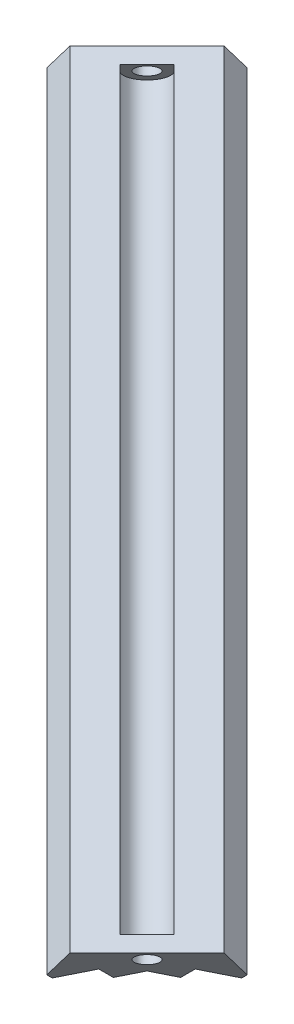
ISO-10303-21;
HEADER;
FILE_DESCRIPTION(('STEP AP214'),'2;1');
FILE_NAME('part.step','',(''),(''),'','','');
FILE_SCHEMA(('AUTOMOTIVE_DESIGN { 1 0 10303 214 1 1 1 1 }'));
ENDSEC;
DATA;
#1=APPLICATION_CONTEXT('core data for automotive mechanical design processes');
#2=APPLICATION_PROTOCOL_DEFINITION('international standard','automotive_design',2000,#1);
#3=PRODUCT_CONTEXT('',#1,'mechanical');
#4=PRODUCT('Part','Part','',(#3));
#5=PRODUCT_RELATED_PRODUCT_CATEGORY('part','',(#4));
#6=PRODUCT_DEFINITION_FORMATION('','',#4);
#7=PRODUCT_DEFINITION_CONTEXT('part definition',#1,'design');
#8=PRODUCT_DEFINITION('design','',#6,#7);
#9=PRODUCT_DEFINITION_SHAPE('','',#8);
#10=(LENGTH_UNIT() NAMED_UNIT(*) SI_UNIT(.MILLI.,.METRE.));
#11=(NAMED_UNIT(*) PLANE_ANGLE_UNIT() SI_UNIT($,.RADIAN.));
#12=(NAMED_UNIT(*) SI_UNIT($,.STERADIAN.) SOLID_ANGLE_UNIT());
#13=UNCERTAINTY_MEASURE_WITH_UNIT(LENGTH_MEASURE(1.E-05),#10,'distance_accuracy_value','');
#14=(GEOMETRIC_REPRESENTATION_CONTEXT(3) GLOBAL_UNCERTAINTY_ASSIGNED_CONTEXT((#13)) GLOBAL_UNIT_ASSIGNED_CONTEXT((#10,
#11,#12)) REPRESENTATION_CONTEXT('',''));
#15=CARTESIAN_POINT('',(0.,0.,0.));
#16=DIRECTION('',(0.,0.,1.));
#17=DIRECTION('',(1.,0.,0.));
#18=AXIS2_PLACEMENT_3D('',#15,#16,#17);
#19=CARTESIAN_POINT('',(-75.8047394497521,-82.0349992201413,-75.8047394497521));
#20=DIRECTION('',(0.577350269189628,-0.577350269189621,0.577350269189628));
#21=DIRECTION('',(0.707106781186547,0.,-0.707106781186548));
#22=AXIS2_PLACEMENT_3D('',#19,#20,#21);
#23=CYLINDRICAL_SURFACE('',#22,1.55000000000003);
#24=CARTESIAN_POINT('',(-69.1083679242941,-88.7313707455993,-69.1083679242941));
#25=DIRECTION('',(0.577350269189626,-0.577350269189626,0.577350269189626));
#26=DIRECTION('',(0.,-0.707106781186548,-0.707106781186548));
#27=AXIS2_PLACEMENT_3D('',#24,#25,#26);
#28=CIRCLE('',#27,1.55000000000003);
#29=CARTESIAN_POINT('',(-69.1083679242941,-89.8273862564385,-70.2043834351332));
#30=VERTEX_POINT('',#29);
#31=EDGE_CURVE('E50',#30,#30,#28,.T.);
#32=ORIENTED_EDGE('',*,*,#31,.F.);
#33=EDGE_LOOP('',(#32));
#34=FACE_BOUND('',#33,.T.);
#35=CARTESIAN_POINT('',(-67.9536673859148,-89.8860712839786,-67.9536673859148));
#36=DIRECTION('',(0.577350269189626,-0.577350269189626,0.577350269189626));
#37=DIRECTION('',(0.,-0.707106781186548,-0.707106781186548));
#38=AXIS2_PLACEMENT_3D('',#35,#36,#37);
#39=CIRCLE('',#38,1.55000000000003);
#40=CARTESIAN_POINT('',(-67.9536673859148,-90.9820867948177,-69.049682896754));
#41=VERTEX_POINT('',#40);
#42=EDGE_CURVE('E193',#41,#41,#39,.F.);
#43=ORIENTED_EDGE('',*,*,#42,.F.);
#44=EDGE_LOOP('',(#43));
#45=FACE_BOUND('',#44,.T.);
#46=ADVANCED_FACE('F46',(#34,#45),#23,.F.);
#47=CARTESIAN_POINT('',(40.6703768682109,-40.6703768682104,40.670376868211));
#48=DIRECTION('',(-0.577350269189628,0.577350269189621,-0.577350269189628));
#49=DIRECTION('',(-0.707106781186548,0.,0.707106781186548));
#50=AXIS2_PLACEMENT_3D('',#47,#48,#49);
#51=PLANE('',#50);
#52=CARTESIAN_POINT('',(-11.9428693550863,-145.896869314806,-11.9428693550863));
#53=DIRECTION('',(-0.577350269189628,0.577350269189621,-0.577350269189628));
#54=DIRECTION('',(-0.707106781186548,0.,0.707106781186548));
#55=AXIS2_PLACEMENT_3D('',#52,#53,#54);
#56=CIRCLE('',#55,1.55000000000003);
#57=CARTESIAN_POINT('',(-13.0388848659255,-145.896869314806,-10.8468538442471));
#58=VERTEX_POINT('',#57);
#59=EDGE_CURVE('E192',#58,#58,#56,.T.);
#60=ORIENTED_EDGE('',*,*,#59,.T.);
#61=EDGE_LOOP('',(#60));
#62=FACE_BOUND('',#61,.T.);
#63=DIRECTION('',(0.816496580927724,0.408248290463864,-0.408248290463865));
#64=VECTOR('',#63,1.);
#65=CARTESIAN_POINT('',(40.6703768682112,-119.614703398697,-38.2739496622747));
#66=LINE('',#65,#64);
#67=CARTESIAN_POINT('',(-21.1505176478224,-150.525150656714,-7.36350240425769));
#68=VERTEX_POINT('',#67);
#69=CARTESIAN_POINT('',(-16.6393740381967,-148.269578851901,-9.61907420907049));
#70=VERTEX_POINT('',#69);
#71=EDGE_CURVE('E246',#68,#70,#66,.T.);
#72=ORIENTED_EDGE('',*,*,#71,.T.);
#73=DIRECTION('',(0.,0.707106781186551,0.707106781186544));
#74=VECTOR('',#73,1.);
#75=CARTESIAN_POINT('',(-16.6393740381967,-148.269578851901,-9.6190742090701));
#76=LINE('',#75,#74);
#77=CARTESIAN_POINT('',(-16.6393740381967,-150.390899195461,-11.7403945526302));
#78=VERTEX_POINT('',#77);
#79=EDGE_CURVE('E233',#78,#70,#76,.T.);
#80=ORIENTED_EDGE('',*,*,#79,.F.);
#81=DIRECTION('',(0.816496580927724,0.408248290463865,-0.408248290463865));
#82=VECTOR('',#81,1.);
#83=CARTESIAN_POINT('',(94.7141414509076,-94.714141450908,-67.4171522971827));
#84=LINE('',#83,#82);
#85=CARTESIAN_POINT('',(-13.3733877144857,-148.757906033605,-13.3733877144857));
#86=VERTEX_POINT('',#85);
#87=EDGE_CURVE('E236',#78,#86,#84,.T.);
#88=ORIENTED_EDGE('',*,*,#87,.T.);
#89=DIRECTION('',(0.408248290463865,-0.408248290463865,-0.816496580927724));
#90=VECTOR('',#89,1.);
#91=CARTESIAN_POINT('',(40.6703768682113,-202.801670616302,-121.460916879879));
#92=LINE('',#91,#90);
#93=CARTESIAN_POINT('',(-11.7403945526303,-150.390899195461,-16.6393740381966));
#94=VERTEX_POINT('',#93);
#95=EDGE_CURVE('E250',#86,#94,#92,.T.);
#96=ORIENTED_EDGE('',*,*,#95,.T.);
#97=DIRECTION('',(0.707106781186544,0.707106781186551,0.));
#98=VECTOR('',#97,1.);
#99=CARTESIAN_POINT('',(-9.61907420907016,-148.269578851901,-16.6393740381966));
#100=LINE('',#99,#98);
#101=CARTESIAN_POINT('',(-9.61907420907059,-148.269578851901,-16.6393740381966));
#102=VERTEX_POINT('',#101);
#103=EDGE_CURVE('E256',#94,#102,#100,.T.);
#104=ORIENTED_EDGE('',*,*,#103,.T.);
#105=DIRECTION('',(0.408248290463865,-0.408248290463865,-0.816496580927724));
#106=VECTOR('',#105,1.);
#107=CARTESIAN_POINT('',(-38.2739496622748,-119.614703398697,40.6703768682113));
#108=LINE('',#107,#106);
#109=CARTESIAN_POINT('',(-7.36350240425779,-150.525150656714,-21.1505176478223));
#110=VERTEX_POINT('',#109);
#111=EDGE_CURVE('E264',#102,#110,#108,.T.);
#112=ORIENTED_EDGE('',*,*,#111,.T.);
#113=DIRECTION('',(0.707106781186544,0.707106781186551,0.));
#114=VECTOR('',#113,1.);
#115=CARTESIAN_POINT('',(-3.99590635885645,-147.157554611312,-21.1505176478224));
#116=LINE('',#115,#114);
#117=CARTESIAN_POINT('',(-6.56975233637543,-149.731400588832,-21.1505176478223));
#118=VERTEX_POINT('',#117);
#119=EDGE_CURVE('E255',#110,#118,#116,.T.);
#120=ORIENTED_EDGE('',*,*,#119,.T.);
#121=DIRECTION('',(0.150523479920982,0.770248798469038,0.619725318548049));
#122=VECTOR('',#121,1.);
#123=CARTESIAN_POINT('',(-5.49330028396715,-144.223051323904,-16.7186204353036));
#124=LINE('',#123,#122);
#125=CARTESIAN_POINT('',(-5.49330028396715,-144.223051323904,-16.7186204353036));
#126=VERTEX_POINT('',#125);
#127=EDGE_CURVE('E212',#118,#126,#124,.T.);
#128=ORIENTED_EDGE('',*,*,#127,.T.);
#129=DIRECTION('',(-0.707106781186552,0.,0.707106781186543));
#130=VECTOR('',#129,1.);
#131=CARTESIAN_POINT('',(-11.1059603596354,-144.223051323905,-11.1059603596354));
#132=LINE('',#131,#130);
#133=CARTESIAN_POINT('',(-16.7186204353036,-144.223051323905,-5.49330028396718));
#134=VERTEX_POINT('',#133);
#135=EDGE_CURVE('E216',#126,#134,#132,.T.);
#136=ORIENTED_EDGE('',*,*,#135,.T.);
#137=DIRECTION('',(-0.619725318548048,-0.77024879846904,-0.150523479920978));
#138=VECTOR('',#137,1.);
#139=CARTESIAN_POINT('',(-21.1505176478224,-149.731400588832,-6.56975233637543));
#140=LINE('',#139,#138);
#141=CARTESIAN_POINT('',(-21.1505176478224,-149.731400588832,-6.56975233637543));
#142=VERTEX_POINT('',#141);
#143=EDGE_CURVE('E200',#134,#142,#140,.T.);
#144=ORIENTED_EDGE('',*,*,#143,.T.);
#145=DIRECTION('',(0.,0.707106781186551,0.707106781186544));
#146=VECTOR('',#145,1.);
#147=CARTESIAN_POINT('',(-21.1505176478224,-147.157554611312,-3.99590635885639));
#148=LINE('',#147,#146);
#149=EDGE_CURVE('E228',#68,#142,#148,.T.);
#150=ORIENTED_EDGE('',*,*,#149,.F.);
#151=EDGE_LOOP('',(#72,#80,#88,#96,#104,#112,#120,#128,#136,#144,#150));
#152=FACE_BOUND('',#151,.T.);
#153=ADVANCED_FACE('F48',(#62,#152),#51,.F.);
#154=CARTESIAN_POINT('',(-16.4951217009963,16.4951217009963,-16.4951217009963));
#155=DIRECTION('',(0.577350269189626,-0.577350269189626,0.577350269189626));
#156=DIRECTION('',(0.,-0.707106781186548,-0.707106781186548));
#157=AXIS2_PLACEMENT_3D('',#154,#155,#156);
#158=PLANE('',#157);
#159=ORIENTED_EDGE('',*,*,#31,.T.);
#160=EDGE_LOOP('',(#159));
#161=FACE_BOUND('',#160,.T.);
#162=DIRECTION('',(0.,-0.707106781186548,-0.707106781186547));
#163=VECTOR('',#162,1.);
#164=CARTESIAN_POINT('',(-78.3160162170298,-89.9920560421053,-61.1614049280644));
#165=LINE('',#164,#163);
#166=CARTESIAN_POINT('',(-78.3160162170298,-92.565902019624,-63.735250905583));
#167=VERTEX_POINT('',#166);
#168=CARTESIAN_POINT('',(-78.3160162170298,-93.3596520875063,-64.5290009734653));
#169=VERTEX_POINT('',#168);
#170=EDGE_CURVE('E71',#167,#169,#165,.T.);
#171=ORIENTED_EDGE('',*,*,#170,.F.);
#172=DIRECTION('',(0.619725318548052,0.770248798469035,0.150523479920983));
#173=VECTOR('',#172,1.);
#174=CARTESIAN_POINT('',(-78.3160162170303,-92.5659020196247,-63.7352509055832));
#175=LINE('',#174,#173);
#176=CARTESIAN_POINT('',(-73.8841190045114,-87.0575527546975,-62.6587988531749));
#177=VERTEX_POINT('',#176);
#178=EDGE_CURVE('E208',#167,#177,#175,.T.);
#179=ORIENTED_EDGE('',*,*,#178,.T.);
#180=DIRECTION('',(0.707106781186551,0.,-0.707106781186544));
#181=VECTOR('',#180,1.);
#182=CARTESIAN_POINT('',(-68.2714589288432,-87.0575527546975,-68.2714589288431));
#183=LINE('',#182,#181);
#184=CARTESIAN_POINT('',(-62.658798853175,-87.0575527546975,-73.8841190045114));
#185=VERTEX_POINT('',#184);
#186=EDGE_CURVE('E204',#177,#185,#183,.T.);
#187=ORIENTED_EDGE('',*,*,#186,.T.);
#188=DIRECTION('',(-0.150523479920984,-0.770248798469036,-0.619725318548051));
#189=VECTOR('',#188,1.);
#190=CARTESIAN_POINT('',(-62.658798853175,-87.0575527546976,-73.8841190045114));
#191=LINE('',#190,#189);
#192=CARTESIAN_POINT('',(-63.7352509055832,-92.5659020196245,-78.3160162170301));
#193=VERTEX_POINT('',#192);
#194=EDGE_CURVE('E201',#185,#193,#191,.T.);
#195=ORIENTED_EDGE('',*,*,#194,.T.);
#196=DIRECTION('',(-0.707106781186547,-0.707106781186548,0.));
#197=VECTOR('',#196,1.);
#198=CARTESIAN_POINT('',(-61.1614049280644,-89.9920560421054,-78.3160162170298));
#199=LINE('',#198,#197);
#200=CARTESIAN_POINT('',(-64.5290009734653,-93.3596520875063,-78.3160162170298));
#201=VERTEX_POINT('',#200);
#202=EDGE_CURVE('E251',#193,#201,#199,.T.);
#203=ORIENTED_EDGE('',*,*,#202,.T.);
#204=DIRECTION('',(-0.408248290463863,0.408248290463863,0.816496580927726));
#205=VECTOR('',#204,1.);
#206=CARTESIAN_POINT('',(-95.439448231482,-62.4492048294895,-16.4951217009963));
#207=LINE('',#206,#205);
#208=CARTESIAN_POINT('',(-66.7845727782781,-91.1040802826934,-73.8048726074041));
#209=VERTEX_POINT('',#208);
#210=EDGE_CURVE('E265',#201,#209,#207,.T.);
#211=ORIENTED_EDGE('',*,*,#210,.T.);
#212=DIRECTION('',(-0.707106781186547,-0.707106781186548,0.));
#213=VECTOR('',#212,1.);
#214=CARTESIAN_POINT('',(-66.7845727782781,-91.1040802826934,-73.8048726074041));
#215=LINE('',#214,#213);
#216=CARTESIAN_POINT('',(-68.9058931218378,-93.2254006262531,-73.8048726074041));
#217=VERTEX_POINT('',#216);
#218=EDGE_CURVE('E227',#209,#217,#215,.T.);
#219=ORIENTED_EDGE('',*,*,#218,.T.);
#220=DIRECTION('',(-0.408248290463863,0.408248290463863,0.816496580927726));
#221=VECTOR('',#220,1.);
#222=CARTESIAN_POINT('',(-16.4951217009963,-145.636172047095,-178.626415449087));
#223=LINE('',#222,#221);
#224=CARTESIAN_POINT('',(-70.5388862836932,-91.5924074643976,-70.5388862836932));
#225=VERTEX_POINT('',#224);
#226=EDGE_CURVE('E260',#217,#225,#223,.T.);
#227=ORIENTED_EDGE('',*,*,#226,.T.);
#228=DIRECTION('',(-0.816496580927726,-0.408248290463863,0.408248290463863));
#229=VECTOR('',#228,1.);
#230=CARTESIAN_POINT('',(37.5486428817007,-37.5486428817007,-124.58265086639));
#231=LINE('',#230,#229);
#232=CARTESIAN_POINT('',(-73.8048726074041,-93.225400626253,-68.9058931218378));
#233=VERTEX_POINT('',#232);
#234=EDGE_CURVE('E242',#225,#233,#231,.T.);
#235=ORIENTED_EDGE('',*,*,#234,.T.);
#236=DIRECTION('',(0.,-0.707106781186548,-0.707106781186547));
#237=VECTOR('',#236,1.);
#238=CARTESIAN_POINT('',(-73.8048726074041,-91.1040802826934,-66.7845727782781));
#239=LINE('',#238,#237);
#240=CARTESIAN_POINT('',(-73.8048726074041,-91.1040802826934,-66.7845727782781));
#241=VERTEX_POINT('',#240);
#242=EDGE_CURVE('E232',#241,#233,#239,.T.);
#243=ORIENTED_EDGE('',*,*,#242,.F.);
#244=DIRECTION('',(-0.816496580927726,-0.408248290463862,0.408248290463863));
#245=VECTOR('',#244,1.);
#246=CARTESIAN_POINT('',(-16.4951217009964,-62.4492048294896,-95.439448231482));
#247=LINE('',#246,#245);
#248=EDGE_CURVE('E247',#241,#169,#247,.T.);
#249=ORIENTED_EDGE('',*,*,#248,.T.);
#250=EDGE_LOOP('',(#171,#179,#187,#195,#203,#211,#219,#227,#235,#243,#249));
#251=FACE_BOUND('',#250,.T.);
#252=ADVANCED_FACE('F351',(#161,#251),#158,.F.);
#253=CARTESIAN_POINT('',(162.131293748091,-162.131293748091,0.));
#254=DIRECTION('',(0.,-0.707106781186548,-0.707106781186547));
#255=DIRECTION('',(-1.,0.,0.));
#256=AXIS2_PLACEMENT_3D('',#253,#254,#255);
#257=PLANE('',#256);
#258=ORIENTED_EDGE('',*,*,#87,.F.);
#259=DIRECTION('',(0.577350269189625,-0.577350269189626,0.577350269189627));
#260=VECTOR('',#259,1.);
#261=CARTESIAN_POINT('',(50.7777782589857,-217.808051492643,55.6767577445524));
#262=LINE('',#261,#260);
#263=EDGE_CURVE('E56',#233,#78,#262,.T.);
#264=ORIENTED_EDGE('',*,*,#263,.F.);
#265=ORIENTED_EDGE('',*,*,#234,.F.);
#266=DIRECTION('',(0.577350269189626,-0.577350269189626,0.577350269189626));
#267=VECTOR('',#266,1.);
#268=CARTESIAN_POINT('',(-54.043764582697,-108.087529165394,-54.0437645826969));
#269=LINE('',#268,#267);
#270=EDGE_CURVE('E276',#225,#86,#269,.T.);
#271=ORIENTED_EDGE('',*,*,#270,.T.);
#272=EDGE_LOOP('',(#258,#264,#265,#271));
#273=FACE_BOUND('',#272,.T.);
#274=ADVANCED_FACE('F346',(#273),#257,.T.);
#275=CARTESIAN_POINT('',(-78.9443265304858,-78.9443265304858,0.));
#276=DIRECTION('',(-0.707106781186547,-0.707106781186548,0.));
#277=DIRECTION('',(0.707106781186548,-0.707106781186547,0.));
#278=AXIS2_PLACEMENT_3D('',#275,#276,#277);
#279=PLANE('',#278);
#280=ORIENTED_EDGE('',*,*,#111,.F.);
#281=DIRECTION('',(0.577350269189626,-0.577350269189626,0.577350269189625));
#282=VECTOR('',#281,1.);
#283=CARTESIAN_POINT('',(-74.0453470449194,-83.8433060160521,-81.0656468740454));
#284=LINE('',#283,#282);
#285=EDGE_CURVE('E280',#209,#102,#284,.T.);
#286=ORIENTED_EDGE('',*,*,#285,.F.);
#287=ORIENTED_EDGE('',*,*,#210,.F.);
#288=DIRECTION('',(0.577350269189626,-0.577350269189626,0.577350269189625));
#289=VECTOR('',#288,1.);
#290=CARTESIAN_POINT('',(-67.2786316304809,-90.6100214304907,-81.0656468740454));
#291=LINE('',#290,#289);
#292=EDGE_CURVE('E284',#201,#110,#291,.T.);
#293=ORIENTED_EDGE('',*,*,#292,.T.);
#294=EDGE_LOOP('',(#280,#286,#287,#293));
#295=FACE_BOUND('',#294,.T.);
#296=ADVANCED_FACE('F320',(#295),#279,.T.);
#297=CARTESIAN_POINT('',(0.,-162.131293748091,-162.131293748091));
#298=DIRECTION('',(-0.707106781186548,-0.707106781186547,0.));
#299=DIRECTION('',(0.,0.,1.));
#300=AXIS2_PLACEMENT_3D('',#297,#298,#299);
#301=PLANE('',#300);
#302=ORIENTED_EDGE('',*,*,#95,.F.);
#303=ORIENTED_EDGE('',*,*,#270,.F.);
#304=ORIENTED_EDGE('',*,*,#226,.F.);
#305=DIRECTION('',(0.577350269189626,-0.577350269189626,0.577350269189625));
#306=VECTOR('',#305,1.);
#307=CARTESIAN_POINT('',(-52.4107714208415,-109.720522327249,-57.3097509064078));
#308=LINE('',#307,#306);
#309=EDGE_CURVE('E272',#217,#94,#308,.T.);
#310=ORIENTED_EDGE('',*,*,#309,.T.);
#311=EDGE_LOOP('',(#302,#303,#304,#310));
#312=FACE_BOUND('',#311,.T.);
#313=ADVANCED_FACE('F349',(#312),#301,.T.);
#314=CARTESIAN_POINT('',(-74.0453470449194,-83.8433060160521,-81.0656468740454));
#315=DIRECTION('',(0.408248290463863,-0.408248290463862,-0.816496580927726));
#316=DIRECTION('',(-0.894427190999916,0.,-0.447213595499958));
#317=AXIS2_PLACEMENT_3D('',#314,#315,#316);
#318=PLANE('',#317);
#319=ORIENTED_EDGE('',*,*,#103,.F.);
#320=ORIENTED_EDGE('',*,*,#309,.F.);
#321=ORIENTED_EDGE('',*,*,#218,.F.);
#322=ORIENTED_EDGE('',*,*,#285,.T.);
#323=EDGE_LOOP('',(#319,#320,#321,#322));
#324=FACE_BOUND('',#323,.T.);
#325=ADVANCED_FACE('F318',(#324),#318,.T.);
#326=CARTESIAN_POINT('',(-63.91103558508,-87.2424253850898,-81.0656468740454));
#327=DIRECTION('',(0.408248290463863,-0.408248290463862,-0.816496580927726));
#328=DIRECTION('',(-0.894427190999916,0.,-0.447213595499958));
#329=AXIS2_PLACEMENT_3D('',#326,#327,#328);
#330=PLANE('',#329);
#331=ORIENTED_EDGE('',*,*,#119,.F.);
#332=ORIENTED_EDGE('',*,*,#292,.F.);
#333=ORIENTED_EDGE('',*,*,#202,.F.);
#334=DIRECTION('',(-0.577350269189626,0.577350269189626,-0.577350269189625));
#335=VECTOR('',#334,1.);
#336=CARTESIAN_POINT('',(-66.4848815625986,-89.8162713626084,-81.0656468740454));
#337=LINE('',#336,#335);
#338=EDGE_CURVE('E239',#118,#193,#337,.T.);
#339=ORIENTED_EDGE('',*,*,#338,.F.);
#340=EDGE_LOOP('',(#331,#332,#333,#339));
#341=FACE_BOUND('',#340,.T.);
#342=ADVANCED_FACE('F324',(#341),#330,.T.);
#343=CARTESIAN_POINT('',(0.,-78.9443265304859,-78.9443265304857));
#344=DIRECTION('',(0.,-0.707106781186548,-0.707106781186547));
#345=DIRECTION('',(0.,-0.707106781186547,0.707106781186548));
#346=AXIS2_PLACEMENT_3D('',#343,#344,#345);
#347=PLANE('',#346);
#348=ORIENTED_EDGE('',*,*,#71,.F.);
#349=DIRECTION('',(0.577350269189625,-0.577350269189626,0.577350269189627));
#350=VECTOR('',#349,1.);
#351=CARTESIAN_POINT('',(-81.0656468740454,-90.6100214304907,-67.2786316304809));
#352=LINE('',#351,#350);
#353=EDGE_CURVE('E292',#169,#68,#352,.T.);
#354=ORIENTED_EDGE('',*,*,#353,.F.);
#355=ORIENTED_EDGE('',*,*,#248,.F.);
#356=DIRECTION('',(0.577350269189625,-0.577350269189626,0.577350269189627));
#357=VECTOR('',#356,1.);
#358=CARTESIAN_POINT('',(-81.0656468740454,-83.8433060160521,-74.0453470449194));
#359=LINE('',#358,#357);
#360=EDGE_CURVE('E288',#241,#70,#359,.T.);
#361=ORIENTED_EDGE('',*,*,#360,.T.);
#362=EDGE_LOOP('',(#348,#354,#355,#361));
#363=FACE_BOUND('',#362,.T.);
#364=ADVANCED_FACE('F338',(#363),#347,.T.);
#365=CARTESIAN_POINT('',(-81.0656468740454,-87.2424253850897,-63.91103558508));
#366=DIRECTION('',(0.816496580927727,0.408248290463862,-0.408248290463863));
#367=DIRECTION('',(-0.447213595499957,0.,-0.894427190999916));
#368=AXIS2_PLACEMENT_3D('',#365,#366,#367);
#369=PLANE('',#368);
#370=ORIENTED_EDGE('',*,*,#353,.T.);
#371=ORIENTED_EDGE('',*,*,#149,.T.);
#372=DIRECTION('',(-0.577350269189625,0.577350269189627,-0.577350269189626));
#373=VECTOR('',#372,1.);
#374=CARTESIAN_POINT('',(-81.0656468740454,-89.8162713626084,-66.4848815625986));
#375=LINE('',#374,#373);
#376=EDGE_CURVE('E12',#142,#167,#375,.T.);
#377=ORIENTED_EDGE('',*,*,#376,.T.);
#378=ORIENTED_EDGE('',*,*,#170,.T.);
#379=EDGE_LOOP('',(#370,#371,#377,#378));
#380=FACE_BOUND('',#379,.T.);
#381=ADVANCED_FACE('F335',(#380),#369,.F.);
#382=CARTESIAN_POINT('',(-81.0656468740454,-83.8433060160521,-74.0453470449194));
#383=DIRECTION('',(0.816496580927727,0.408248290463862,-0.408248290463863));
#384=DIRECTION('',(-0.447213595499957,0.,-0.894427190999916));
#385=AXIS2_PLACEMENT_3D('',#382,#383,#384);
#386=PLANE('',#385);
#387=ORIENTED_EDGE('',*,*,#263,.T.);
#388=ORIENTED_EDGE('',*,*,#79,.T.);
#389=ORIENTED_EDGE('',*,*,#360,.F.);
#390=ORIENTED_EDGE('',*,*,#242,.T.);
#391=EDGE_LOOP('',(#387,#388,#389,#390));
#392=FACE_BOUND('',#391,.T.);
#393=ADVANCED_FACE('F344',(#392),#386,.F.);
#394=CARTESIAN_POINT('',(-80.8859143709571,-74.4430973125838,-80.8859143709571));
#395=DIRECTION('',(0.408248290463853,0.81649658092773,0.408248290463866));
#396=DIRECTION('',(0.,-0.447213595499959,0.894427190999916));
#397=AXIS2_PLACEMENT_3D('',#394,#395,#396);
#398=PLANE('',#397);
#399=DIRECTION('',(0.707106781186551,0.,-0.707106781186544));
#400=VECTOR('',#399,1.);
#401=CARTESIAN_POINT('',(-12.2606608980147,-143.068350785525,-12.2606608980146));
#402=LINE('',#401,#400);
#403=CARTESIAN_POINT('',(-14.240559885337,-143.068350785525,-10.2807619106923));
#404=VERTEX_POINT('',#403);
#405=CARTESIAN_POINT('',(-10.2807619106923,-143.068350785525,-14.240559885337));
#406=VERTEX_POINT('',#405);
#407=EDGE_CURVE('E178',#404,#406,#402,.T.);
#408=ORIENTED_EDGE('',*,*,#407,.F.);
#409=DIRECTION('',(0.577350269189629,-0.577350269189621,0.577350269189628));
#410=VECTOR('',#409,1.);
#411=CARTESIAN_POINT('',(-75.953282542504,-81.3556281283591,-71.9934845678593));
#412=LINE('',#411,#410);
#413=CARTESIAN_POINT('',(-69.0966573777863,-88.2122532930767,-65.1368594031416));
#414=VERTEX_POINT('',#413);
#415=EDGE_CURVE('E159',#414,#404,#412,.T.);
#416=ORIENTED_EDGE('',*,*,#415,.F.);
#417=DIRECTION('',(0.707106781186551,0.,-0.707106781186544));
#418=VECTOR('',#417,1.);
#419=CARTESIAN_POINT('',(-67.1167583904639,-88.2122532930768,-67.1167583904639));
#420=LINE('',#419,#418);
#421=CARTESIAN_POINT('',(-65.1368594031416,-88.2122532930767,-69.0966573777862));
#422=VERTEX_POINT('',#421);
#423=EDGE_CURVE('E187',#414,#422,#420,.T.);
#424=ORIENTED_EDGE('',*,*,#423,.T.);
#425=DIRECTION('',(0.577350269189629,-0.577350269189621,0.577350269189628));
#426=VECTOR('',#425,1.);
#427=CARTESIAN_POINT('',(-71.9934845678593,-81.3556281283591,-75.9532825425039));
#428=LINE('',#427,#426);
#429=EDGE_CURVE('E64',#422,#406,#428,.T.);
#430=ORIENTED_EDGE('',*,*,#429,.T.);
#431=EDGE_LOOP('',(#408,#416,#424,#430));
#432=FACE_BOUND('',#431,.T.);
#433=ORIENTED_EDGE('',*,*,#186,.F.);
#434=DIRECTION('',(0.577350269189628,-0.57735026918962,0.577350269189628));
#435=VECTOR('',#434,1.);
#436=CARTESIAN_POINT('',(-86.4985744466253,-74.4430973125838,-75.2732542952889));
#437=LINE('',#436,#435);
#438=EDGE_CURVE('E220',#177,#134,#437,.T.);
#439=ORIENTED_EDGE('',*,*,#438,.T.);
#440=ORIENTED_EDGE('',*,*,#135,.F.);
#441=DIRECTION('',(0.577350269189628,-0.57735026918962,0.577350269189628));
#442=VECTOR('',#441,1.);
#443=CARTESIAN_POINT('',(-75.2732542952889,-74.4430973125837,-86.4985744466253));
#444=LINE('',#443,#442);
#445=EDGE_CURVE('E205',#185,#126,#444,.T.);
#446=ORIENTED_EDGE('',*,*,#445,.F.);
#447=EDGE_LOOP('',(#433,#439,#440,#446));
#448=FACE_BOUND('',#447,.T.);
#449=ADVANCED_FACE('F184',(#432,#448),#398,.T.);
#450=CARTESIAN_POINT('',(-75.2732542952889,-74.4430973125837,-86.4985744466253));
#451=DIRECTION('',(0.802501930626426,0.270893807835606,-0.531608122790824));
#452=DIRECTION('',(-0.552257449715118,0.,-0.833673622729036));
#453=AXIS2_PLACEMENT_3D('',#450,#451,#452);
#454=PLANE('',#453);
#455=ORIENTED_EDGE('',*,*,#194,.F.);
#456=ORIENTED_EDGE('',*,*,#445,.T.);
#457=ORIENTED_EDGE('',*,*,#127,.F.);
#458=ORIENTED_EDGE('',*,*,#338,.T.);
#459=EDGE_LOOP('',(#455,#456,#457,#458));
#460=FACE_BOUND('',#459,.T.);
#461=ADVANCED_FACE('F353',(#460),#454,.T.);
#462=CARTESIAN_POINT('',(-90.9304716591441,-79.9514465775109,-76.3497063476971));
#463=DIRECTION('',(-0.531608122790823,0.270893807835607,0.802501930626427));
#464=DIRECTION('',(0.833673622729036,0.,0.552257449715117));
#465=AXIS2_PLACEMENT_3D('',#462,#463,#464);
#466=PLANE('',#465);
#467=ORIENTED_EDGE('',*,*,#178,.F.);
#468=ORIENTED_EDGE('',*,*,#376,.F.);
#469=ORIENTED_EDGE('',*,*,#143,.F.);
#470=ORIENTED_EDGE('',*,*,#438,.F.);
#471=EDGE_LOOP('',(#467,#468,#469,#470));
#472=FACE_BOUND('',#471,.T.);
#473=ADVANCED_FACE('F333',(#472),#466,.T.);
#474=CARTESIAN_POINT('',(-13.0975698934655,-144.742168776427,-13.0975698934655));
#475=DIRECTION('',(0.577350269189629,-0.577350269189621,0.577350269189628));
#476=DIRECTION('',(0.707106781186547,0.,-0.707106781186548));
#477=AXIS2_PLACEMENT_3D('',#474,#475,#476);
#478=CIRCLE('',#477,1.55000000000003);
#479=CARTESIAN_POINT('',(-12.0015543826264,-144.742168776427,-14.1935854043047));
#480=VERTEX_POINT('',#479);
#481=EDGE_CURVE('E182',#480,#480,#478,.T.);
#482=ORIENTED_EDGE('',*,*,#481,.F.);
#483=EDGE_LOOP('',(#482));
#484=FACE_BOUND('',#483,.T.);
#485=ORIENTED_EDGE('',*,*,#59,.F.);
#486=EDGE_LOOP('',(#485));
#487=FACE_BOUND('',#486,.T.);
#488=ADVANCED_FACE('F360',(#484,#487),#23,.F.);
#489=CARTESIAN_POINT('',(-75.953282542504,-81.3556281283591,-71.9934845678593));
#490=DIRECTION('',(-0.707106781186546,0.,0.70710678118655));
#491=DIRECTION('',(0.70710678118655,0.,0.707106781186546));
#492=AXIS2_PLACEMENT_3D('',#489,#490,#491);
#493=PLANE('',#492);
#494=DIRECTION('',(0.408248290463866,0.816496580927726,0.40824829046386));
#495=VECTOR('',#494,1.);
#496=CARTESIAN_POINT('',(-69.0966573777863,-88.2122532930768,-65.1368594031416));
#497=LINE('',#496,#495);
#498=CARTESIAN_POINT('',(-69.9335663732372,-89.8860712839786,-65.9737683985925));
#499=VERTEX_POINT('',#498);
#500=EDGE_CURVE('E165',#499,#414,#497,.T.);
#501=ORIENTED_EDGE('',*,*,#500,.T.);
#502=ORIENTED_EDGE('',*,*,#415,.T.);
#503=DIRECTION('',(-0.40824829046386,-0.816496580927733,-0.408248290463853));
#504=VECTOR('',#503,1.);
#505=CARTESIAN_POINT('',(-14.240559885337,-143.068350785525,-10.2807619106923));
#506=LINE('',#505,#504);
#507=CARTESIAN_POINT('',(-15.0774688807879,-144.742168776427,-11.1176709061432));
#508=VERTEX_POINT('',#507);
#509=EDGE_CURVE('E163',#404,#508,#506,.T.);
#510=ORIENTED_EDGE('',*,*,#509,.T.);
#511=DIRECTION('',(0.577350269189629,-0.577350269189621,0.577350269189628));
#512=VECTOR('',#511,1.);
#513=CARTESIAN_POINT('',(-76.7901915379549,-83.029446119261,-72.8303935633102));
#514=LINE('',#513,#512);
#515=EDGE_CURVE('E170',#499,#508,#514,.T.);
#516=ORIENTED_EDGE('',*,*,#515,.F.);
#517=EDGE_LOOP('',(#501,#502,#510,#516));
#518=FACE_BOUND('',#517,.T.);
#519=ADVANCED_FACE('F161',(#518),#493,.F.);
#520=CARTESIAN_POINT('',(-74.8102925506325,-83.0294461192609,-74.8102925506325));
#521=DIRECTION('',(0.577350269189629,-0.577350269189621,0.577350269189628));
#522=DIRECTION('',(0.707106781186547,0.,-0.707106781186548));
#523=AXIS2_PLACEMENT_3D('',#520,#521,#522);
#524=CYLINDRICAL_SURFACE('',#523,2.80000000000002);
#525=CARTESIAN_POINT('',(-67.9536673859148,-89.8860712839786,-67.9536673859148));
#526=DIRECTION('',(0.577350269189626,-0.577350269189626,0.577350269189626));
#527=DIRECTION('',(0.,-0.707106781186548,-0.707106781186548));
#528=AXIS2_PLACEMENT_3D('',#525,#526,#527);
#529=CIRCLE('',#528,2.80000000000002);
#530=CARTESIAN_POINT('',(-65.9737683985925,-89.8860712839785,-69.9335663732371));
#531=VERTEX_POINT('',#530);
#532=EDGE_CURVE('E396',#531,#499,#529,.F.);
#533=ORIENTED_EDGE('',*,*,#532,.T.);
#534=ORIENTED_EDGE('',*,*,#515,.T.);
#535=CARTESIAN_POINT('',(-13.0975698934655,-144.742168776427,-13.0975698934655));
#536=DIRECTION('',(0.577350269189629,-0.577350269189621,0.577350269189628));
#537=DIRECTION('',(0.707106781186547,0.,-0.707106781186548));
#538=AXIS2_PLACEMENT_3D('',#535,#536,#537);
#539=CIRCLE('',#538,2.80000000000002);
#540=CARTESIAN_POINT('',(-11.1176709061432,-144.742168776427,-15.0774688807879));
#541=VERTEX_POINT('',#540);
#542=EDGE_CURVE('E180',#508,#541,#539,.T.);
#543=ORIENTED_EDGE('',*,*,#542,.T.);
#544=DIRECTION('',(0.577350269189629,-0.577350269189621,0.577350269189628));
#545=VECTOR('',#544,1.);
#546=CARTESIAN_POINT('',(-72.8303935633102,-83.0294461192609,-76.7901915379548));
#547=LINE('',#546,#545);
#548=EDGE_CURVE('E397',#531,#541,#547,.T.);
#549=ORIENTED_EDGE('',*,*,#548,.F.);
#550=EDGE_LOOP('',(#533,#534,#543,#549));
#551=FACE_BOUND('',#550,.T.);
#552=ADVANCED_FACE('F379',(#551),#524,.F.);
#553=CARTESIAN_POINT('',(-71.9934845678593,-81.3556281283591,-75.9532825425039));
#554=DIRECTION('',(0.707106781186552,0.,-0.707106781186543));
#555=DIRECTION('',(-0.707106781186543,0.,-0.707106781186552));
#556=AXIS2_PLACEMENT_3D('',#553,#554,#555);
#557=PLANE('',#556);
#558=DIRECTION('',(-0.408248290463855,-0.816496580927726,-0.408248290463872));
#559=VECTOR('',#558,1.);
#560=CARTESIAN_POINT('',(-65.1368594031416,-88.2122532930768,-69.0966573777862));
#561=LINE('',#560,#559);
#562=EDGE_CURVE('E387',#422,#531,#561,.T.);
#563=ORIENTED_EDGE('',*,*,#562,.T.);
#564=ORIENTED_EDGE('',*,*,#548,.T.);
#565=DIRECTION('',(0.408248290463851,0.816496580927729,0.408248290463868));
#566=VECTOR('',#565,1.);
#567=CARTESIAN_POINT('',(-10.2807619106923,-143.068350785525,-14.240559885337));
#568=LINE('',#567,#566);
#569=EDGE_CURVE('E171',#541,#406,#568,.T.);
#570=ORIENTED_EDGE('',*,*,#569,.T.);
#571=ORIENTED_EDGE('',*,*,#429,.F.);
#572=EDGE_LOOP('',(#563,#564,#570,#571));
#573=FACE_BOUND('',#572,.T.);
#574=ADVANCED_FACE('F414',(#573),#557,.F.);
#575=CARTESIAN_POINT('',(-12.2606608980146,-143.068350785525,-12.2606608980146));
#576=DIRECTION('',(0.577350269189629,-0.577350269189621,0.577350269189628));
#577=DIRECTION('',(0.707106781186547,0.,-0.707106781186548));
#578=AXIS2_PLACEMENT_3D('',#575,#576,#577);
#579=PLANE('',#578);
#580=ORIENTED_EDGE('',*,*,#407,.T.);
#581=ORIENTED_EDGE('',*,*,#569,.F.);
#582=ORIENTED_EDGE('',*,*,#542,.F.);
#583=ORIENTED_EDGE('',*,*,#509,.F.);
#584=EDGE_LOOP('',(#580,#581,#582,#583));
#585=FACE_BOUND('',#584,.T.);
#586=ORIENTED_EDGE('',*,*,#481,.T.);
#587=EDGE_LOOP('',(#586));
#588=FACE_BOUND('',#587,.T.);
#589=ADVANCED_FACE('F175',(#585,#588),#579,.F.);
#590=CARTESIAN_POINT('',(-15.340421162617,15.340421162617,-15.340421162617));
#591=DIRECTION('',(0.577350269189626,-0.577350269189626,0.577350269189626));
#592=DIRECTION('',(0.,-0.707106781186548,-0.707106781186548));
#593=AXIS2_PLACEMENT_3D('',#590,#591,#592);
#594=PLANE('',#593);
#595=ORIENTED_EDGE('',*,*,#500,.F.);
#596=ORIENTED_EDGE('',*,*,#532,.F.);
#597=ORIENTED_EDGE('',*,*,#562,.F.);
#598=ORIENTED_EDGE('',*,*,#423,.F.);
#599=EDGE_LOOP('',(#595,#596,#597,#598));
#600=FACE_BOUND('',#599,.T.);
#601=ORIENTED_EDGE('',*,*,#42,.T.);
#602=EDGE_LOOP('',(#601));
#603=FACE_BOUND('',#602,.T.);
#604=ADVANCED_FACE('F413',(#600,#603),#594,.T.);
#605=CLOSED_SHELL('',(#46,#153,#252,#274,#296,#313,#325,#342,#364,#381,#393,#449,#461,#473,#488,
#519,#552,#574,#589,#604));
#606=MANIFOLD_SOLID_BREP('B2',#605);
#607=ADVANCED_BREP_SHAPE_REPRESENTATION('',(#18,#606),#14);
#608=SHAPE_DEFINITION_REPRESENTATION(#9,#607);
ENDSEC;
END-ISO-10303-21;
